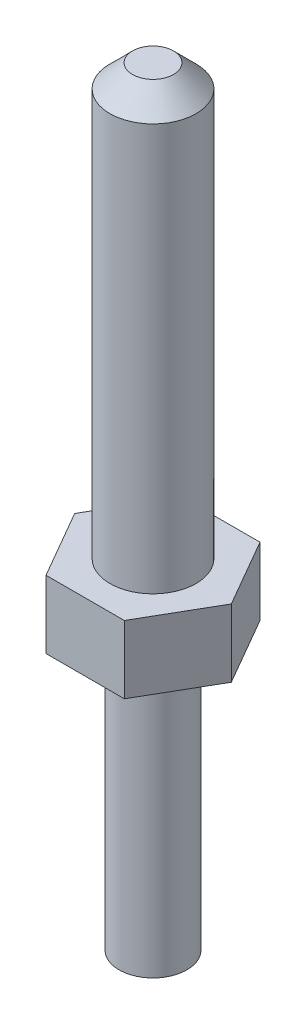
ISO-10303-21;
HEADER;
FILE_DESCRIPTION(('STEP AP214'),'2;1');
FILE_NAME('part.step','',(''),(''),'','','');
FILE_SCHEMA(('AUTOMOTIVE_DESIGN { 1 0 10303 214 1 1 1 1 }'));
ENDSEC;
DATA;
#1=APPLICATION_CONTEXT('core data for automotive mechanical design processes');
#2=APPLICATION_PROTOCOL_DEFINITION('international standard','automotive_design',2000,#1);
#3=PRODUCT_CONTEXT('',#1,'mechanical');
#4=PRODUCT('Part','Part','',(#3));
#5=PRODUCT_RELATED_PRODUCT_CATEGORY('part','',(#4));
#6=PRODUCT_DEFINITION_FORMATION('','',#4);
#7=PRODUCT_DEFINITION_CONTEXT('part definition',#1,'design');
#8=PRODUCT_DEFINITION('design','',#6,#7);
#9=PRODUCT_DEFINITION_SHAPE('','',#8);
#10=(LENGTH_UNIT() NAMED_UNIT(*) SI_UNIT(.MILLI.,.METRE.));
#11=(NAMED_UNIT(*) PLANE_ANGLE_UNIT() SI_UNIT($,.RADIAN.));
#12=(NAMED_UNIT(*) SI_UNIT($,.STERADIAN.) SOLID_ANGLE_UNIT());
#13=UNCERTAINTY_MEASURE_WITH_UNIT(LENGTH_MEASURE(1.E-05),#10,'distance_accuracy_value','');
#14=(GEOMETRIC_REPRESENTATION_CONTEXT(3) GLOBAL_UNCERTAINTY_ASSIGNED_CONTEXT((#13)) GLOBAL_UNIT_ASSIGNED_CONTEXT((#10,
#11,#12)) REPRESENTATION_CONTEXT('',''));
#15=CARTESIAN_POINT('',(0.,0.,0.));
#16=DIRECTION('',(0.,0.,1.));
#17=DIRECTION('',(1.,0.,0.));
#18=AXIS2_PLACEMENT_3D('',#15,#16,#17);
#19=CARTESIAN_POINT('',(0.,34.,0.));
#20=DIRECTION('',(0.,-1.,0.));
#21=DIRECTION('',(0.,0.,-1.));
#22=AXIS2_PLACEMENT_3D('',#19,#20,#21);
#23=PLANE('',#22);
#24=CARTESIAN_POINT('',(0.,34.,0.));
#25=DIRECTION('',(0.,-1.,0.));
#26=DIRECTION('',(0.,0.,-1.));
#27=AXIS2_PLACEMENT_3D('',#24,#25,#26);
#28=CIRCLE('',#27,0.904999999999985);
#29=CARTESIAN_POINT('',(0.,34.,-0.904999999999985));
#30=VERTEX_POINT('',#29);
#31=EDGE_CURVE('E11',#30,#30,#28,.F.);
#32=ORIENTED_EDGE('',*,*,#31,.T.);
#33=EDGE_LOOP('',(#32));
#34=FACE_BOUND('',#33,.T.);
#35=ADVANCED_FACE('F39',(#34),#23,.F.);
#36=CARTESIAN_POINT('',(0.,0.,0.));
#37=DIRECTION('',(0.,-1.,0.));
#38=DIRECTION('',(0.,0.,-1.));
#39=AXIS2_PLACEMENT_3D('',#36,#37,#38);
#40=CYLINDRICAL_SURFACE('',#39,1.905);
#41=CARTESIAN_POINT('',(0.,33.,0.));
#42=DIRECTION('',(0.,-1.,0.));
#43=DIRECTION('',(0.,0.,-1.));
#44=AXIS2_PLACEMENT_3D('',#41,#42,#43);
#45=CIRCLE('',#44,1.905);
#46=CARTESIAN_POINT('',(0.,33.,-1.905));
#47=VERTEX_POINT('',#46);
#48=EDGE_CURVE('E49',#47,#47,#45,.T.);
#49=ORIENTED_EDGE('',*,*,#48,.T.);
#50=EDGE_LOOP('',(#49));
#51=FACE_BOUND('',#50,.T.);
#52=CARTESIAN_POINT('',(0.,15.,0.));
#53=DIRECTION('',(0.,-1.,0.));
#54=DIRECTION('',(0.,0.,-1.));
#55=AXIS2_PLACEMENT_3D('',#52,#53,#54);
#56=CIRCLE('',#55,1.905);
#57=CARTESIAN_POINT('',(0.,15.,-1.905));
#58=VERTEX_POINT('',#57);
#59=EDGE_CURVE('E144',#58,#58,#56,.T.);
#60=ORIENTED_EDGE('',*,*,#59,.F.);
#61=EDGE_LOOP('',(#60));
#62=FACE_BOUND('',#61,.T.);
#63=ADVANCED_FACE('F149',(#51,#62),#40,.T.);
#64=CARTESIAN_POINT('',(-1.905,15.,0.));
#65=DIRECTION('',(0.,-1.,0.));
#66=DIRECTION('',(0.,0.,-1.));
#67=AXIS2_PLACEMENT_3D('',#64,#65,#66);
#68=PLANE('',#67);
#69=ORIENTED_EDGE('',*,*,#59,.T.);
#70=EDGE_LOOP('',(#69));
#71=FACE_BOUND('',#70,.T.);
#72=DIRECTION('',(-0.5,0.,0.866025403784439));
#73=VECTOR('',#72,1.);
#74=CARTESIAN_POINT('',(-1.73205080756888,15.,-3.));
#75=LINE('',#74,#73);
#76=CARTESIAN_POINT('',(-1.73205080756888,15.,-3.));
#77=VERTEX_POINT('',#76);
#78=CARTESIAN_POINT('',(-3.46410161513775,15.,0.));
#79=VERTEX_POINT('',#78);
#80=EDGE_CURVE('E94',#77,#79,#75,.T.);
#81=ORIENTED_EDGE('',*,*,#80,.T.);
#82=DIRECTION('',(0.5,0.,0.866025403784439));
#83=VECTOR('',#82,1.);
#84=CARTESIAN_POINT('',(-3.46410161513775,15.,0.));
#85=LINE('',#84,#83);
#86=CARTESIAN_POINT('',(-1.73205080756888,15.,3.));
#87=VERTEX_POINT('',#86);
#88=EDGE_CURVE('E104',#79,#87,#85,.T.);
#89=ORIENTED_EDGE('',*,*,#88,.T.);
#90=DIRECTION('',(1.,0.,0.));
#91=VECTOR('',#90,1.);
#92=CARTESIAN_POINT('',(-1.73205080756888,15.,3.));
#93=LINE('',#92,#91);
#94=CARTESIAN_POINT('',(1.73205080756888,15.,3.));
#95=VERTEX_POINT('',#94);
#96=EDGE_CURVE('E110',#87,#95,#93,.T.);
#97=ORIENTED_EDGE('',*,*,#96,.T.);
#98=DIRECTION('',(0.5,0.,-0.866025403784439));
#99=VECTOR('',#98,1.);
#100=CARTESIAN_POINT('',(1.73205080756888,15.,3.));
#101=LINE('',#100,#99);
#102=CARTESIAN_POINT('',(3.46410161513775,15.,0.));
#103=VERTEX_POINT('',#102);
#104=EDGE_CURVE('E120',#95,#103,#101,.T.);
#105=ORIENTED_EDGE('',*,*,#104,.T.);
#106=DIRECTION('',(-0.5,0.,-0.866025403784439));
#107=VECTOR('',#106,1.);
#108=CARTESIAN_POINT('',(3.46410161513775,15.,0.));
#109=LINE('',#108,#107);
#110=CARTESIAN_POINT('',(1.73205080756888,15.,-3.));
#111=VERTEX_POINT('',#110);
#112=EDGE_CURVE('E123',#103,#111,#109,.T.);
#113=ORIENTED_EDGE('',*,*,#112,.T.);
#114=DIRECTION('',(-1.,0.,0.));
#115=VECTOR('',#114,1.);
#116=CARTESIAN_POINT('',(1.73205080756888,15.,-3.));
#117=LINE('',#116,#115);
#118=EDGE_CURVE('E101',#111,#77,#117,.T.);
#119=ORIENTED_EDGE('',*,*,#118,.T.);
#120=EDGE_LOOP('',(#81,#89,#97,#105,#113,#119));
#121=FACE_BOUND('',#120,.T.);
#122=ADVANCED_FACE('F112',(#71,#121),#68,.F.);
#123=CARTESIAN_POINT('',(-1.73205080756888,2.83484861008832,-3.));
#124=DIRECTION('',(-0.866025403784439,0.,-0.5));
#125=DIRECTION('',(-0.5,0.,0.866025403784439));
#126=AXIS2_PLACEMENT_3D('',#123,#124,#125);
#127=PLANE('',#126);
#128=DIRECTION('',(0.5,0.,-0.866025403784439));
#129=VECTOR('',#128,1.);
#130=CARTESIAN_POINT('',(-1.73205080756888,12.,-3.));
#131=LINE('',#130,#129);
#132=CARTESIAN_POINT('',(-3.46410161513775,12.,0.));
#133=VERTEX_POINT('',#132);
#134=CARTESIAN_POINT('',(-1.73205080756888,12.,-3.));
#135=VERTEX_POINT('',#134);
#136=EDGE_CURVE('E97',#133,#135,#131,.T.);
#137=ORIENTED_EDGE('',*,*,#136,.F.);
#138=DIRECTION('',(0.,1.,0.));
#139=VECTOR('',#138,1.);
#140=CARTESIAN_POINT('',(-3.46410161513775,2.83484861008832,0.));
#141=LINE('',#140,#139);
#142=EDGE_CURVE('E89',#133,#79,#141,.T.);
#143=ORIENTED_EDGE('',*,*,#142,.T.);
#144=ORIENTED_EDGE('',*,*,#80,.F.);
#145=DIRECTION('',(0.,1.,0.));
#146=VECTOR('',#145,1.);
#147=CARTESIAN_POINT('',(-1.73205080756888,2.83484861008832,-3.));
#148=LINE('',#147,#146);
#149=EDGE_CURVE('E126',#135,#77,#148,.T.);
#150=ORIENTED_EDGE('',*,*,#149,.F.);
#151=EDGE_LOOP('',(#137,#143,#144,#150));
#152=FACE_BOUND('',#151,.T.);
#153=ADVANCED_FACE('F91',(#152),#127,.T.);
#154=CARTESIAN_POINT('',(1.73205080756888,2.83484861008832,-3.));
#155=DIRECTION('',(0.,0.,-1.));
#156=DIRECTION('',(-1.,0.,0.));
#157=AXIS2_PLACEMENT_3D('',#154,#155,#156);
#158=PLANE('',#157);
#159=DIRECTION('',(1.,0.,0.));
#160=VECTOR('',#159,1.);
#161=CARTESIAN_POINT('',(1.73205080756888,12.,-3.));
#162=LINE('',#161,#160);
#163=CARTESIAN_POINT('',(1.73205080756888,12.,-3.));
#164=VERTEX_POINT('',#163);
#165=EDGE_CURVE('E203',#135,#164,#162,.T.);
#166=ORIENTED_EDGE('',*,*,#165,.F.);
#167=ORIENTED_EDGE('',*,*,#149,.T.);
#168=ORIENTED_EDGE('',*,*,#118,.F.);
#169=DIRECTION('',(0.,1.,0.));
#170=VECTOR('',#169,1.);
#171=CARTESIAN_POINT('',(1.73205080756888,2.83484861008832,-3.));
#172=LINE('',#171,#170);
#173=EDGE_CURVE('E129',#164,#111,#172,.T.);
#174=ORIENTED_EDGE('',*,*,#173,.F.);
#175=EDGE_LOOP('',(#166,#167,#168,#174));
#176=FACE_BOUND('',#175,.T.);
#177=ADVANCED_FACE('F182',(#176),#158,.T.);
#178=CARTESIAN_POINT('',(3.46410161513775,2.83484861008832,0.));
#179=DIRECTION('',(0.866025403784439,0.,-0.5));
#180=DIRECTION('',(-0.5,0.,-0.866025403784439));
#181=AXIS2_PLACEMENT_3D('',#178,#179,#180);
#182=PLANE('',#181);
#183=DIRECTION('',(0.5,0.,0.866025403784439));
#184=VECTOR('',#183,1.);
#185=CARTESIAN_POINT('',(3.46410161513775,12.,0.));
#186=LINE('',#185,#184);
#187=CARTESIAN_POINT('',(3.46410161513775,12.,0.));
#188=VERTEX_POINT('',#187);
#189=EDGE_CURVE('E205',#164,#188,#186,.T.);
#190=ORIENTED_EDGE('',*,*,#189,.F.);
#191=ORIENTED_EDGE('',*,*,#173,.T.);
#192=ORIENTED_EDGE('',*,*,#112,.F.);
#193=DIRECTION('',(0.,1.,0.));
#194=VECTOR('',#193,1.);
#195=CARTESIAN_POINT('',(3.46410161513775,2.83484861008832,0.));
#196=LINE('',#195,#194);
#197=EDGE_CURVE('E131',#188,#103,#196,.T.);
#198=ORIENTED_EDGE('',*,*,#197,.F.);
#199=EDGE_LOOP('',(#190,#191,#192,#198));
#200=FACE_BOUND('',#199,.T.);
#201=ADVANCED_FACE('F192',(#200),#182,.T.);
#202=CARTESIAN_POINT('',(1.73205080756888,2.83484861008832,3.));
#203=DIRECTION('',(0.866025403784439,0.,0.5));
#204=DIRECTION('',(0.5,0.,-0.866025403784439));
#205=AXIS2_PLACEMENT_3D('',#202,#203,#204);
#206=PLANE('',#205);
#207=DIRECTION('',(-0.5,0.,0.866025403784439));
#208=VECTOR('',#207,1.);
#209=CARTESIAN_POINT('',(1.73205080756888,12.,3.));
#210=LINE('',#209,#208);
#211=CARTESIAN_POINT('',(1.73205080756888,12.,3.));
#212=VERTEX_POINT('',#211);
#213=EDGE_CURVE('E56',#188,#212,#210,.T.);
#214=ORIENTED_EDGE('',*,*,#213,.F.);
#215=ORIENTED_EDGE('',*,*,#197,.T.);
#216=ORIENTED_EDGE('',*,*,#104,.F.);
#217=DIRECTION('',(0.,1.,0.));
#218=VECTOR('',#217,1.);
#219=CARTESIAN_POINT('',(1.73205080756888,2.83484861008832,3.));
#220=LINE('',#219,#218);
#221=EDGE_CURVE('E133',#212,#95,#220,.T.);
#222=ORIENTED_EDGE('',*,*,#221,.F.);
#223=EDGE_LOOP('',(#214,#215,#216,#222));
#224=FACE_BOUND('',#223,.T.);
#225=ADVANCED_FACE('F188',(#224),#206,.T.);
#226=CARTESIAN_POINT('',(-1.73205080756888,2.83484861008832,3.));
#227=DIRECTION('',(0.,0.,1.));
#228=DIRECTION('',(1.,0.,0.));
#229=AXIS2_PLACEMENT_3D('',#226,#227,#228);
#230=PLANE('',#229);
#231=DIRECTION('',(-1.,0.,0.));
#232=VECTOR('',#231,1.);
#233=CARTESIAN_POINT('',(-1.73205080756888,12.,3.));
#234=LINE('',#233,#232);
#235=CARTESIAN_POINT('',(-1.73205080756888,12.,3.));
#236=VERTEX_POINT('',#235);
#237=EDGE_CURVE('E128',#212,#236,#234,.T.);
#238=ORIENTED_EDGE('',*,*,#237,.F.);
#239=ORIENTED_EDGE('',*,*,#221,.T.);
#240=ORIENTED_EDGE('',*,*,#96,.F.);
#241=DIRECTION('',(0.,1.,0.));
#242=VECTOR('',#241,1.);
#243=CARTESIAN_POINT('',(-1.73205080756888,2.83484861008832,3.));
#244=LINE('',#243,#242);
#245=EDGE_CURVE('E100',#236,#87,#244,.T.);
#246=ORIENTED_EDGE('',*,*,#245,.F.);
#247=EDGE_LOOP('',(#238,#239,#240,#246));
#248=FACE_BOUND('',#247,.T.);
#249=ADVANCED_FACE('F185',(#248),#230,.T.);
#250=CARTESIAN_POINT('',(-3.46410161513775,2.83484861008832,0.));
#251=DIRECTION('',(-0.866025403784439,0.,0.5));
#252=DIRECTION('',(0.5,0.,0.866025403784439));
#253=AXIS2_PLACEMENT_3D('',#250,#251,#252);
#254=PLANE('',#253);
#255=DIRECTION('',(-0.5,0.,-0.866025403784439));
#256=VECTOR('',#255,1.);
#257=CARTESIAN_POINT('',(-3.46410161513775,12.,0.));
#258=LINE('',#257,#256);
#259=EDGE_CURVE('E136',#236,#133,#258,.T.);
#260=ORIENTED_EDGE('',*,*,#259,.F.);
#261=ORIENTED_EDGE('',*,*,#245,.T.);
#262=ORIENTED_EDGE('',*,*,#88,.F.);
#263=ORIENTED_EDGE('',*,*,#142,.F.);
#264=EDGE_LOOP('',(#260,#261,#262,#263));
#265=FACE_BOUND('',#264,.T.);
#266=ADVANCED_FACE('F105',(#265),#254,.T.);
#267=CARTESIAN_POINT('',(-1.5,0.,0.));
#268=DIRECTION('',(0.,1.,0.));
#269=DIRECTION('',(0.,0.,1.));
#270=AXIS2_PLACEMENT_3D('',#267,#268,#269);
#271=PLANE('',#270);
#272=CARTESIAN_POINT('',(0.,0.,0.));
#273=DIRECTION('',(0.,-1.,0.));
#274=DIRECTION('',(0.,0.,-1.));
#275=AXIS2_PLACEMENT_3D('',#272,#273,#274);
#276=CIRCLE('',#275,1.5);
#277=CARTESIAN_POINT('',(0.,0.,-1.5));
#278=VERTEX_POINT('',#277);
#279=EDGE_CURVE('E138',#278,#278,#276,.T.);
#280=ORIENTED_EDGE('',*,*,#279,.T.);
#281=EDGE_LOOP('',(#280));
#282=FACE_BOUND('',#281,.T.);
#283=ADVANCED_FACE('F175',(#282),#271,.F.);
#284=CARTESIAN_POINT('',(0.,0.,0.));
#285=DIRECTION('',(0.,-1.,0.));
#286=DIRECTION('',(0.,0.,-1.));
#287=AXIS2_PLACEMENT_3D('',#284,#285,#286);
#288=CYLINDRICAL_SURFACE('',#287,1.5);
#289=ORIENTED_EDGE('',*,*,#279,.F.);
#290=EDGE_LOOP('',(#289));
#291=FACE_BOUND('',#290,.T.);
#292=CARTESIAN_POINT('',(0.,12.,0.));
#293=DIRECTION('',(0.,-1.,0.));
#294=DIRECTION('',(0.,0.,-1.));
#295=AXIS2_PLACEMENT_3D('',#292,#293,#294);
#296=CIRCLE('',#295,1.5);
#297=CARTESIAN_POINT('',(0.,12.,-1.5));
#298=VERTEX_POINT('',#297);
#299=EDGE_CURVE('E141',#298,#298,#296,.T.);
#300=ORIENTED_EDGE('',*,*,#299,.T.);
#301=EDGE_LOOP('',(#300));
#302=FACE_BOUND('',#301,.T.);
#303=ADVANCED_FACE('F158',(#291,#302),#288,.T.);
#304=CARTESIAN_POINT('',(-2.5,12.,0.));
#305=DIRECTION('',(0.,1.,0.));
#306=DIRECTION('',(0.,0.,1.));
#307=AXIS2_PLACEMENT_3D('',#304,#305,#306);
#308=PLANE('',#307);
#309=ORIENTED_EDGE('',*,*,#299,.F.);
#310=EDGE_LOOP('',(#309));
#311=FACE_BOUND('',#310,.T.);
#312=ORIENTED_EDGE('',*,*,#136,.T.);
#313=ORIENTED_EDGE('',*,*,#165,.T.);
#314=ORIENTED_EDGE('',*,*,#189,.T.);
#315=ORIENTED_EDGE('',*,*,#213,.T.);
#316=ORIENTED_EDGE('',*,*,#237,.T.);
#317=ORIENTED_EDGE('',*,*,#259,.T.);
#318=EDGE_LOOP('',(#312,#313,#314,#315,#316,#317));
#319=FACE_BOUND('',#318,.T.);
#320=ADVANCED_FACE('F153',(#311,#319),#308,.F.);
#321=CARTESIAN_POINT('',(0.,33.,0.));
#322=DIRECTION('',(0.,-1.,0.));
#323=DIRECTION('',(0.,0.,-1.));
#324=AXIS2_PLACEMENT_3D('',#321,#322,#323);
#325=CONICAL_SURFACE('',#324,1.905,0.785398163397451);
#326=ORIENTED_EDGE('',*,*,#31,.F.);
#327=EDGE_LOOP('',(#326));
#328=FACE_BOUND('',#327,.T.);
#329=ORIENTED_EDGE('',*,*,#48,.F.);
#330=EDGE_LOOP('',(#329));
#331=FACE_BOUND('',#330,.T.);
#332=ADVANCED_FACE('F42',(#328,#331),#325,.T.);
#333=CLOSED_SHELL('',(#35,#63,#122,#153,#177,#201,#225,#249,#266,#283,#303,#320,#332));
#334=MANIFOLD_SOLID_BREP('B2',#333);
#335=ADVANCED_BREP_SHAPE_REPRESENTATION('',(#18,#334),#14);
#336=SHAPE_DEFINITION_REPRESENTATION(#9,#335);
ENDSEC;
END-ISO-10303-21;
